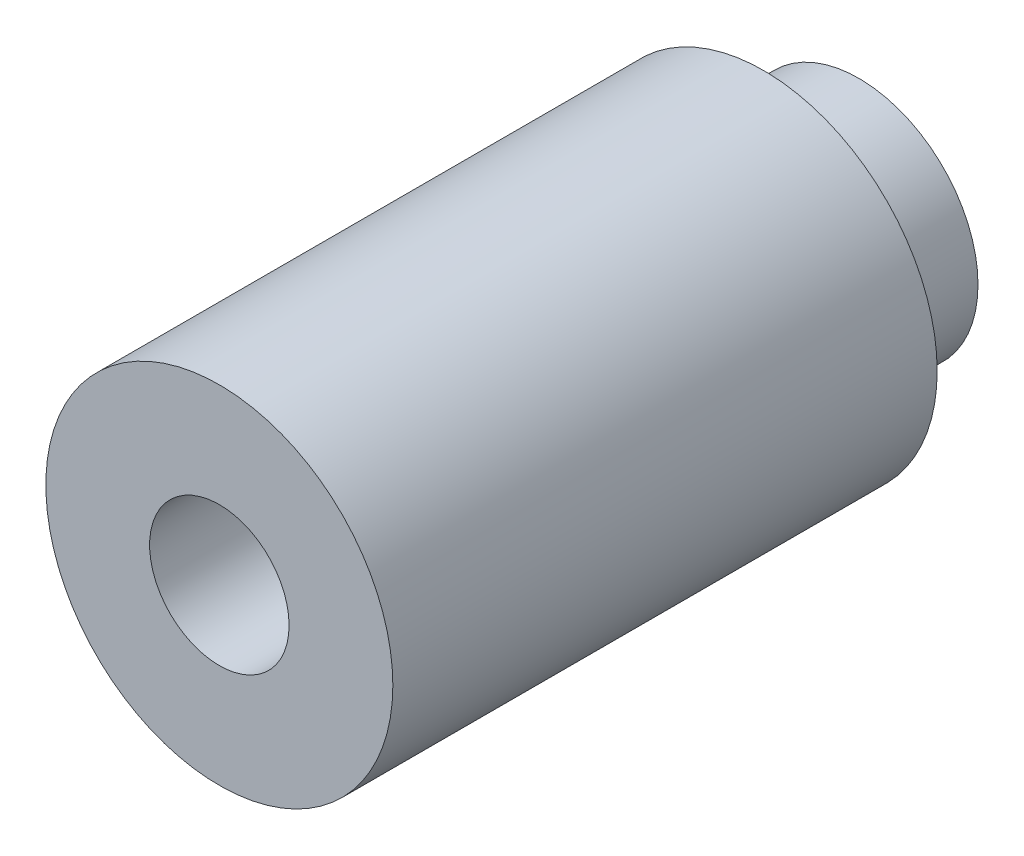
ISO-10303-21;
HEADER;
FILE_DESCRIPTION(('STEP AP214'),'2;1');
FILE_NAME('part.step','',(''),(''),'','','');
FILE_SCHEMA(('AUTOMOTIVE_DESIGN { 1 0 10303 214 1 1 1 1 }'));
ENDSEC;
DATA;
#1=APPLICATION_CONTEXT('core data for automotive mechanical design processes');
#2=APPLICATION_PROTOCOL_DEFINITION('international standard','automotive_design',2000,#1);
#3=PRODUCT_CONTEXT('',#1,'mechanical');
#4=PRODUCT('Part','Part','',(#3));
#5=PRODUCT_RELATED_PRODUCT_CATEGORY('part','',(#4));
#6=PRODUCT_DEFINITION_FORMATION('','',#4);
#7=PRODUCT_DEFINITION_CONTEXT('part definition',#1,'design');
#8=PRODUCT_DEFINITION('design','',#6,#7);
#9=PRODUCT_DEFINITION_SHAPE('','',#8);
#10=(LENGTH_UNIT() NAMED_UNIT(*) SI_UNIT(.MILLI.,.METRE.));
#11=(NAMED_UNIT(*) PLANE_ANGLE_UNIT() SI_UNIT($,.RADIAN.));
#12=(NAMED_UNIT(*) SI_UNIT($,.STERADIAN.) SOLID_ANGLE_UNIT());
#13=UNCERTAINTY_MEASURE_WITH_UNIT(LENGTH_MEASURE(1.E-05),#10,'distance_accuracy_value','');
#14=(GEOMETRIC_REPRESENTATION_CONTEXT(3) GLOBAL_UNCERTAINTY_ASSIGNED_CONTEXT((#13)) GLOBAL_UNIT_ASSIGNED_CONTEXT((#10,
#11,#12)) REPRESENTATION_CONTEXT('',''));
#15=CARTESIAN_POINT('',(0.,0.,0.));
#16=DIRECTION('',(0.,0.,1.));
#17=DIRECTION('',(1.,0.,0.));
#18=AXIS2_PLACEMENT_3D('',#15,#16,#17);
#19=CARTESIAN_POINT('',(0.,0.,8.));
#20=DIRECTION('',(0.,0.,-1.));
#21=DIRECTION('',(-1.,0.,0.));
#22=AXIS2_PLACEMENT_3D('',#19,#20,#21);
#23=CYLINDRICAL_SURFACE('',#22,2.55);
#24=CARTESIAN_POINT('',(0.,0.,8.));
#25=DIRECTION('',(0.,0.,1.));
#26=DIRECTION('',(1.,0.,0.));
#27=AXIS2_PLACEMENT_3D('',#24,#25,#26);
#28=CIRCLE('',#27,2.55);
#29=CARTESIAN_POINT('',(2.55,0.,8.));
#30=VERTEX_POINT('',#29);
#31=EDGE_CURVE('E10',#30,#30,#28,.T.);
#32=ORIENTED_EDGE('',*,*,#31,.F.);
#33=EDGE_LOOP('',(#32));
#34=FACE_BOUND('',#33,.T.);
#35=CARTESIAN_POINT('',(0.,0.,0.));
#36=DIRECTION('',(0.,0.,1.));
#37=DIRECTION('',(1.,0.,0.));
#38=AXIS2_PLACEMENT_3D('',#35,#36,#37);
#39=CIRCLE('',#38,2.55);
#40=CARTESIAN_POINT('',(2.55,0.,0.));
#41=VERTEX_POINT('',#40);
#42=EDGE_CURVE('E36',#41,#41,#39,.T.);
#43=ORIENTED_EDGE('',*,*,#42,.T.);
#44=EDGE_LOOP('',(#43));
#45=FACE_BOUND('',#44,.T.);
#46=ADVANCED_FACE('F33',(#34,#45),#23,.T.);
#47=CARTESIAN_POINT('',(0.,0.,8.));
#48=DIRECTION('',(0.,0.,1.));
#49=DIRECTION('',(1.,0.,0.));
#50=AXIS2_PLACEMENT_3D('',#47,#48,#49);
#51=PLANE('',#50);
#52=CARTESIAN_POINT('',(0.,0.,8.));
#53=DIRECTION('',(0.,0.,1.));
#54=DIRECTION('',(1.,0.,0.));
#55=AXIS2_PLACEMENT_3D('',#52,#53,#54);
#56=CIRCLE('',#55,1.02499999999999);
#57=CARTESIAN_POINT('',(1.02499999999999,0.,8.));
#58=VERTEX_POINT('',#57);
#59=EDGE_CURVE('E53',#58,#58,#56,.T.);
#60=ORIENTED_EDGE('',*,*,#59,.F.);
#61=EDGE_LOOP('',(#60));
#62=FACE_BOUND('',#61,.T.);
#63=ORIENTED_EDGE('',*,*,#31,.T.);
#64=EDGE_LOOP('',(#63));
#65=FACE_BOUND('',#64,.T.);
#66=ADVANCED_FACE('F59',(#62,#65),#51,.T.);
#67=CARTESIAN_POINT('',(0.,0.,0.));
#68=DIRECTION('',(0.,0.,1.));
#69=DIRECTION('',(1.,0.,0.));
#70=AXIS2_PLACEMENT_3D('',#67,#68,#69);
#71=PLANE('',#70);
#72=CARTESIAN_POINT('',(0.,0.,0.));
#73=DIRECTION('',(0.,0.,1.));
#74=DIRECTION('',(1.,0.,0.));
#75=AXIS2_PLACEMENT_3D('',#72,#73,#74);
#76=CIRCLE('',#75,1.75);
#77=CARTESIAN_POINT('',(1.75,0.,0.));
#78=VERTEX_POINT('',#77);
#79=EDGE_CURVE('E45',#78,#78,#76,.T.);
#80=ORIENTED_EDGE('',*,*,#79,.T.);
#81=EDGE_LOOP('',(#80));
#82=FACE_BOUND('',#81,.T.);
#83=ORIENTED_EDGE('',*,*,#42,.F.);
#84=EDGE_LOOP('',(#83));
#85=FACE_BOUND('',#84,.T.);
#86=ADVANCED_FACE('F61',(#82,#85),#71,.F.);
#87=CARTESIAN_POINT('',(0.,0.,-1.4));
#88=DIRECTION('',(0.,0.,1.));
#89=DIRECTION('',(1.,0.,0.));
#90=AXIS2_PLACEMENT_3D('',#87,#88,#89);
#91=CYLINDRICAL_SURFACE('',#90,1.75);
#92=CARTESIAN_POINT('',(0.,0.,-1.4));
#93=DIRECTION('',(0.,0.,1.));
#94=DIRECTION('',(1.,0.,0.));
#95=AXIS2_PLACEMENT_3D('',#92,#93,#94);
#96=CIRCLE('',#95,1.75);
#97=CARTESIAN_POINT('',(1.75,0.,-1.4));
#98=VERTEX_POINT('',#97);
#99=EDGE_CURVE('E43',#98,#98,#96,.T.);
#100=ORIENTED_EDGE('',*,*,#99,.T.);
#101=EDGE_LOOP('',(#100));
#102=FACE_BOUND('',#101,.T.);
#103=ORIENTED_EDGE('',*,*,#79,.F.);
#104=EDGE_LOOP('',(#103));
#105=FACE_BOUND('',#104,.T.);
#106=ADVANCED_FACE('F67',(#102,#105),#91,.T.);
#107=CARTESIAN_POINT('',(0.,0.,-1.4));
#108=DIRECTION('',(0.,0.,1.));
#109=DIRECTION('',(1.,0.,0.));
#110=AXIS2_PLACEMENT_3D('',#107,#108,#109);
#111=PLANE('',#110);
#112=CARTESIAN_POINT('',(0.,0.,-1.4));
#113=DIRECTION('',(0.,0.,1.));
#114=DIRECTION('',(1.,0.,0.));
#115=AXIS2_PLACEMENT_3D('',#112,#113,#114);
#116=CIRCLE('',#115,1.02499999999999);
#117=CARTESIAN_POINT('',(1.02499999999999,0.,-1.4));
#118=VERTEX_POINT('',#117);
#119=EDGE_CURVE('E48',#118,#118,#116,.T.);
#120=ORIENTED_EDGE('',*,*,#119,.T.);
#121=EDGE_LOOP('',(#120));
#122=FACE_BOUND('',#121,.T.);
#123=ORIENTED_EDGE('',*,*,#99,.F.);
#124=EDGE_LOOP('',(#123));
#125=FACE_BOUND('',#124,.T.);
#126=ADVANCED_FACE('F73',(#122,#125),#111,.F.);
#127=CARTESIAN_POINT('',(0.,0.,8.));
#128=DIRECTION('',(0.,0.,1.));
#129=DIRECTION('',(1.,0.,0.));
#130=AXIS2_PLACEMENT_3D('',#127,#128,#129);
#131=CYLINDRICAL_SURFACE('',#130,1.02499999999999);
#132=ORIENTED_EDGE('',*,*,#119,.F.);
#133=EDGE_LOOP('',(#132));
#134=FACE_BOUND('',#133,.T.);
#135=ORIENTED_EDGE('',*,*,#59,.T.);
#136=EDGE_LOOP('',(#135));
#137=FACE_BOUND('',#136,.T.);
#138=ADVANCED_FACE('F57',(#134,#137),#131,.F.);
#139=CLOSED_SHELL('',(#46,#66,#86,#106,#126,#138));
#140=MANIFOLD_SOLID_BREP('B2',#139);
#141=ADVANCED_BREP_SHAPE_REPRESENTATION('',(#18,#140),#14);
#142=SHAPE_DEFINITION_REPRESENTATION(#9,#141);
ENDSEC;
END-ISO-10303-21;
